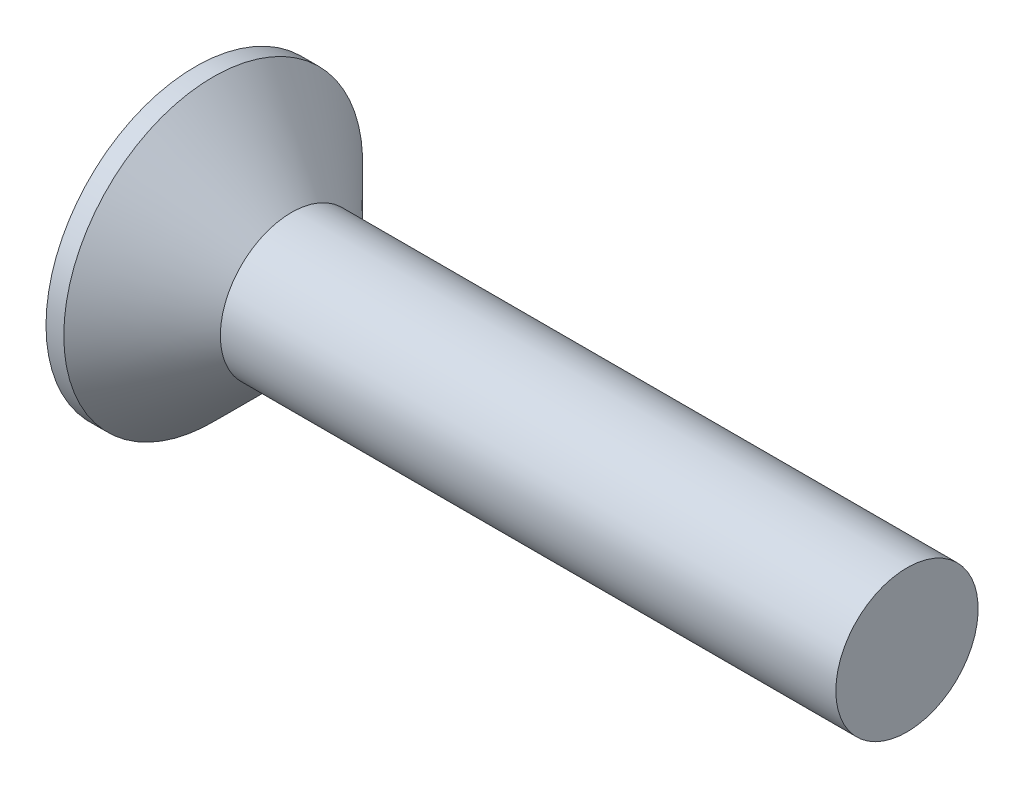
ISO-10303-21;
HEADER;
FILE_DESCRIPTION(('STEP AP214'),'2;1');
FILE_NAME('part.step','',(''),(''),'','','');
FILE_SCHEMA(('AUTOMOTIVE_DESIGN { 1 0 10303 214 1 1 1 1 }'));
ENDSEC;
DATA;
#1=APPLICATION_CONTEXT('core data for automotive mechanical design processes');
#2=APPLICATION_PROTOCOL_DEFINITION('international standard','automotive_design',2000,#1);
#3=PRODUCT_CONTEXT('',#1,'mechanical');
#4=PRODUCT('Part','Part','',(#3));
#5=PRODUCT_RELATED_PRODUCT_CATEGORY('part','',(#4));
#6=PRODUCT_DEFINITION_FORMATION('','',#4);
#7=PRODUCT_DEFINITION_CONTEXT('part definition',#1,'design');
#8=PRODUCT_DEFINITION('design','',#6,#7);
#9=PRODUCT_DEFINITION_SHAPE('','',#8);
#10=(LENGTH_UNIT() NAMED_UNIT(*) SI_UNIT(.MILLI.,.METRE.));
#11=(NAMED_UNIT(*) PLANE_ANGLE_UNIT() SI_UNIT($,.RADIAN.));
#12=(NAMED_UNIT(*) SI_UNIT($,.STERADIAN.) SOLID_ANGLE_UNIT());
#13=UNCERTAINTY_MEASURE_WITH_UNIT(LENGTH_MEASURE(1.E-05),#10,'distance_accuracy_value','');
#14=(GEOMETRIC_REPRESENTATION_CONTEXT(3) GLOBAL_UNCERTAINTY_ASSIGNED_CONTEXT((#13)) GLOBAL_UNIT_ASSIGNED_CONTEXT((#10,
#11,#12)) REPRESENTATION_CONTEXT('',''));
#15=CARTESIAN_POINT('',(0.,0.,0.));
#16=DIRECTION('',(0.,0.,1.));
#17=DIRECTION('',(1.,0.,0.));
#18=AXIS2_PLACEMENT_3D('',#15,#16,#17);
#19=CARTESIAN_POINT('',(2.65,0.24,-0.24));
#20=DIRECTION('',(1.,0.,0.));
#21=DIRECTION('',(0.,0.,-1.));
#22=AXIS2_PLACEMENT_3D('',#19,#20,#21);
#23=PLANE('',#22);
#24=DIRECTION('',(0.,0.,1.));
#25=VECTOR('',#24,1.);
#26=CARTESIAN_POINT('',(2.65,-0.240000000000001,-0.48));
#27=LINE('',#26,#25);
#28=CARTESIAN_POINT('',(2.65,-0.240000000000001,0.24));
#29=VERTEX_POINT('',#28);
#30=CARTESIAN_POINT('',(2.65,-0.24,-0.240000000000001));
#31=VERTEX_POINT('',#30);
#32=EDGE_CURVE('E83',#29,#31,#27,.F.);
#33=ORIENTED_EDGE('',*,*,#32,.F.);
#34=DIRECTION('',(0.,1.,0.));
#35=VECTOR('',#34,1.);
#36=CARTESIAN_POINT('',(2.65,-0.480000000000007,0.239999999999999));
#37=LINE('',#36,#35);
#38=CARTESIAN_POINT('',(2.65,0.24,0.24));
#39=VERTEX_POINT('',#38);
#40=EDGE_CURVE('E122',#39,#29,#37,.F.);
#41=ORIENTED_EDGE('',*,*,#40,.F.);
#42=DIRECTION('',(0.,0.,1.));
#43=VECTOR('',#42,1.);
#44=CARTESIAN_POINT('',(2.65,0.24,0.48));
#45=LINE('',#44,#43);
#46=CARTESIAN_POINT('',(2.65,0.24,-0.24));
#47=VERTEX_POINT('',#46);
#48=EDGE_CURVE('E79',#47,#39,#45,.T.);
#49=ORIENTED_EDGE('',*,*,#48,.F.);
#50=DIRECTION('',(0.,1.,0.));
#51=VECTOR('',#50,1.);
#52=CARTESIAN_POINT('',(2.65,0.480000000000007,-0.239999999999999));
#53=LINE('',#52,#51);
#54=EDGE_CURVE('E81',#31,#47,#53,.T.);
#55=ORIENTED_EDGE('',*,*,#54,.F.);
#56=EDGE_LOOP('',(#33,#41,#49,#55));
#57=FACE_BOUND('',#56,.T.);
#58=ADVANCED_FACE('F17',(#57),#23,.F.);
#59=CARTESIAN_POINT('',(0.,0.480000000000007,-2.23));
#60=DIRECTION('',(-0.600482690889725,0.,0.799637754199885));
#61=DIRECTION('',(0.799637754199885,0.,0.600482690889725));
#62=AXIS2_PLACEMENT_3D('',#59,#60,#61);
#63=PLANE('',#62);
#64=DIRECTION('',(-0.797549052549738,-0.0722308575894082,-0.59891419417886));
#65=VECTOR('',#64,1.);
#66=CARTESIAN_POINT('',(2.65,-0.239999999999999,-0.240000000000001));
#67=LINE('',#66,#65);
#68=CARTESIAN_POINT('',(0.,-0.479999999999994,-2.23));
#69=VERTEX_POINT('',#68);
#70=EDGE_CURVE('E100',#31,#69,#67,.T.);
#71=ORIENTED_EDGE('',*,*,#70,.F.);
#72=ORIENTED_EDGE('',*,*,#54,.T.);
#73=DIRECTION('',(0.797549052549738,-0.0722308575894123,0.59891419417886));
#74=VECTOR('',#73,1.);
#75=CARTESIAN_POINT('',(0.,0.480000000000008,-2.23));
#76=LINE('',#75,#74);
#77=CARTESIAN_POINT('',(0.,0.480000000000008,-2.23));
#78=VERTEX_POINT('',#77);
#79=EDGE_CURVE('E115',#78,#47,#76,.T.);
#80=ORIENTED_EDGE('',*,*,#79,.F.);
#81=DIRECTION('',(0.,1.,0.));
#82=VECTOR('',#81,1.);
#83=CARTESIAN_POINT('',(0.,0.480000000000007,-2.23));
#84=LINE('',#83,#82);
#85=EDGE_CURVE('E90',#78,#69,#84,.F.);
#86=ORIENTED_EDGE('',*,*,#85,.T.);
#87=EDGE_LOOP('',(#71,#72,#80,#86));
#88=FACE_BOUND('',#87,.T.);
#89=ADVANCED_FACE('F101',(#88),#63,.T.);
#90=CARTESIAN_POINT('',(0.,2.23,0.48));
#91=DIRECTION('',(-0.600482690889725,-0.799637754199885,0.));
#92=DIRECTION('',(0.799637754199885,-0.600482690889725,0.));
#93=AXIS2_PLACEMENT_3D('',#90,#91,#92);
#94=PLANE('',#93);
#95=DIRECTION('',(-0.797549052549738,0.59891419417886,-0.0722308575894102));
#96=VECTOR('',#95,1.);
#97=CARTESIAN_POINT('',(2.65,0.24,-0.24));
#98=LINE('',#97,#96);
#99=CARTESIAN_POINT('',(0.,2.23,-0.48));
#100=VERTEX_POINT('',#99);
#101=EDGE_CURVE('E156',#47,#100,#98,.T.);
#102=ORIENTED_EDGE('',*,*,#101,.F.);
#103=ORIENTED_EDGE('',*,*,#48,.T.);
#104=DIRECTION('',(0.797549052549738,-0.59891419417886,-0.0722308575894101));
#105=VECTOR('',#104,1.);
#106=CARTESIAN_POINT('',(0.,2.23,0.48));
#107=LINE('',#106,#105);
#108=CARTESIAN_POINT('',(0.,2.23,0.48));
#109=VERTEX_POINT('',#108);
#110=EDGE_CURVE('E153',#109,#39,#107,.T.);
#111=ORIENTED_EDGE('',*,*,#110,.F.);
#112=DIRECTION('',(0.,0.,1.));
#113=VECTOR('',#112,1.);
#114=CARTESIAN_POINT('',(0.,2.23,0.48));
#115=LINE('',#114,#113);
#116=EDGE_CURVE('E89',#109,#100,#115,.F.);
#117=ORIENTED_EDGE('',*,*,#116,.T.);
#118=EDGE_LOOP('',(#102,#103,#111,#117));
#119=FACE_BOUND('',#118,.T.);
#120=ADVANCED_FACE('F171',(#119),#94,.T.);
#121=CARTESIAN_POINT('',(0.,-0.480000000000007,2.23));
#122=DIRECTION('',(-0.600482690889725,0.,-0.799637754199885));
#123=DIRECTION('',(-0.799637754199885,0.,0.600482690889725));
#124=AXIS2_PLACEMENT_3D('',#121,#122,#123);
#125=PLANE('',#124);
#126=DIRECTION('',(-0.797549052549738,0.0722308575894081,0.59891419417886));
#127=VECTOR('',#126,1.);
#128=CARTESIAN_POINT('',(2.65,0.239999999999999,0.24));
#129=LINE('',#128,#127);
#130=CARTESIAN_POINT('',(0.,0.479999999999993,2.23));
#131=VERTEX_POINT('',#130);
#132=EDGE_CURVE('E150',#39,#131,#129,.T.);
#133=ORIENTED_EDGE('',*,*,#132,.F.);
#134=ORIENTED_EDGE('',*,*,#40,.T.);
#135=DIRECTION('',(0.797549052549738,0.0722308575894122,-0.59891419417886));
#136=VECTOR('',#135,1.);
#137=CARTESIAN_POINT('',(0.,-0.480000000000007,2.23));
#138=LINE('',#137,#136);
#139=CARTESIAN_POINT('',(0.,-0.480000000000007,2.23));
#140=VERTEX_POINT('',#139);
#141=EDGE_CURVE('E144',#140,#29,#138,.T.);
#142=ORIENTED_EDGE('',*,*,#141,.F.);
#143=DIRECTION('',(0.,1.,0.));
#144=VECTOR('',#143,1.);
#145=CARTESIAN_POINT('',(0.,-0.480000000000007,2.23));
#146=LINE('',#145,#144);
#147=EDGE_CURVE('E124',#140,#131,#146,.T.);
#148=ORIENTED_EDGE('',*,*,#147,.T.);
#149=EDGE_LOOP('',(#133,#134,#142,#148));
#150=FACE_BOUND('',#149,.T.);
#151=ADVANCED_FACE('F199',(#150),#125,.T.);
#152=CARTESIAN_POINT('',(0.,-2.23,-0.48));
#153=DIRECTION('',(-0.600482690889725,0.799637754199885,0.));
#154=DIRECTION('',(-0.799637754199885,-0.600482690889725,0.));
#155=AXIS2_PLACEMENT_3D('',#152,#153,#154);
#156=PLANE('',#155);
#157=DIRECTION('',(-0.797549052549738,-0.59891419417886,0.0722308575894103));
#158=VECTOR('',#157,1.);
#159=CARTESIAN_POINT('',(2.65,-0.240000000000001,0.24));
#160=LINE('',#159,#158);
#161=CARTESIAN_POINT('',(0.,-2.23,0.48));
#162=VERTEX_POINT('',#161);
#163=EDGE_CURVE('E96',#29,#162,#160,.T.);
#164=ORIENTED_EDGE('',*,*,#163,.F.);
#165=ORIENTED_EDGE('',*,*,#32,.T.);
#166=DIRECTION('',(0.797549052549738,0.59891419417886,0.0722308575894102));
#167=VECTOR('',#166,1.);
#168=CARTESIAN_POINT('',(0.,-2.23,-0.48));
#169=LINE('',#168,#167);
#170=CARTESIAN_POINT('',(0.,-2.23,-0.48));
#171=VERTEX_POINT('',#170);
#172=EDGE_CURVE('E94',#171,#31,#169,.T.);
#173=ORIENTED_EDGE('',*,*,#172,.F.);
#174=DIRECTION('',(0.,0.,1.));
#175=VECTOR('',#174,1.);
#176=CARTESIAN_POINT('',(0.,-2.23,-0.48));
#177=LINE('',#176,#175);
#178=EDGE_CURVE('E35',#171,#162,#177,.T.);
#179=ORIENTED_EDGE('',*,*,#178,.T.);
#180=EDGE_LOOP('',(#164,#165,#173,#179));
#181=FACE_BOUND('',#180,.T.);
#182=ADVANCED_FACE('F92',(#181),#156,.T.);
#183=CARTESIAN_POINT('',(2.96959798994975,0.,-0.21105527638191));
#184=DIRECTION('',(-0.0901968863789277,0.,0.995923953767328));
#185=DIRECTION('',(0.995923953767328,0.,0.0901968863789277));
#186=AXIS2_PLACEMENT_3D('',#183,#184,#185);
#187=PLANE('',#186);
#188=DIRECTION('',(0.991897347093265,0.0898322125669369,0.0898322125669369));
#189=VECTOR('',#188,1.);
#190=CARTESIAN_POINT('',(0.,-0.479999999999998,-0.48));
#191=LINE('',#190,#189);
#192=CARTESIAN_POINT('',(0.,-0.479999999999998,-0.48));
#193=VERTEX_POINT('',#192);
#194=EDGE_CURVE('E106',#193,#31,#191,.T.);
#195=ORIENTED_EDGE('',*,*,#194,.F.);
#196=DIRECTION('',(0.,1.,0.));
#197=VECTOR('',#196,1.);
#198=CARTESIAN_POINT('',(0.,0.,-0.48));
#199=LINE('',#198,#197);
#200=EDGE_CURVE('E111',#171,#193,#199,.T.);
#201=ORIENTED_EDGE('',*,*,#200,.F.);
#202=ORIENTED_EDGE('',*,*,#172,.T.);
#203=EDGE_LOOP('',(#195,#201,#202));
#204=FACE_BOUND('',#203,.T.);
#205=ADVANCED_FACE('F109',(#204),#187,.T.);
#206=CARTESIAN_POINT('',(2.96959798994975,-0.21105527638191,0.));
#207=DIRECTION('',(-0.0901968863789278,0.995923953767328,0.));
#208=DIRECTION('',(-0.995923953767328,-0.0901968863789278,0.));
#209=AXIS2_PLACEMENT_3D('',#206,#207,#208);
#210=PLANE('',#209);
#211=DIRECTION('',(0.,0.,1.));
#212=VECTOR('',#211,1.);
#213=CARTESIAN_POINT('',(0.,-0.479999999999998,0.));
#214=LINE('',#213,#212);
#215=EDGE_CURVE('E114',#193,#69,#214,.F.);
#216=ORIENTED_EDGE('',*,*,#215,.F.);
#217=ORIENTED_EDGE('',*,*,#194,.T.);
#218=ORIENTED_EDGE('',*,*,#70,.T.);
#219=EDGE_LOOP('',(#216,#217,#218));
#220=FACE_BOUND('',#219,.T.);
#221=ADVANCED_FACE('F113',(#220),#210,.T.);
#222=CARTESIAN_POINT('',(2.96959798994975,0.21105527638191,0.));
#223=DIRECTION('',(-0.0901968863789277,-0.995923953767328,0.));
#224=DIRECTION('',(0.995923953767328,-0.0901968863789277,0.));
#225=AXIS2_PLACEMENT_3D('',#222,#223,#224);
#226=PLANE('',#225);
#227=ORIENTED_EDGE('',*,*,#79,.T.);
#228=DIRECTION('',(0.991897347093265,-0.0898322125669377,0.0898322125669371));
#229=VECTOR('',#228,1.);
#230=CARTESIAN_POINT('',(0.,0.480000000000001,-0.48));
#231=LINE('',#230,#229);
#232=CARTESIAN_POINT('',(0.,0.480000000000003,-0.48));
#233=VERTEX_POINT('',#232);
#234=EDGE_CURVE('E117',#233,#47,#231,.T.);
#235=ORIENTED_EDGE('',*,*,#234,.F.);
#236=DIRECTION('',(0.,0.,1.));
#237=VECTOR('',#236,1.);
#238=CARTESIAN_POINT('',(0.,0.480000000000008,0.));
#239=LINE('',#238,#237);
#240=EDGE_CURVE('E169',#78,#233,#239,.T.);
#241=ORIENTED_EDGE('',*,*,#240,.F.);
#242=EDGE_LOOP('',(#227,#235,#241));
#243=FACE_BOUND('',#242,.T.);
#244=ADVANCED_FACE('F168',(#243),#226,.T.);
#245=CARTESIAN_POINT('',(2.96959798994975,0.,-0.21105527638191));
#246=DIRECTION('',(-0.0901968863789277,0.,0.995923953767328));
#247=DIRECTION('',(0.995923953767328,0.,0.0901968863789277));
#248=AXIS2_PLACEMENT_3D('',#245,#246,#247);
#249=PLANE('',#248);
#250=ORIENTED_EDGE('',*,*,#234,.T.);
#251=ORIENTED_EDGE('',*,*,#101,.T.);
#252=DIRECTION('',(0.,1.,0.));
#253=VECTOR('',#252,1.);
#254=CARTESIAN_POINT('',(0.,0.,-0.48));
#255=LINE('',#254,#253);
#256=EDGE_CURVE('E164',#233,#100,#255,.T.);
#257=ORIENTED_EDGE('',*,*,#256,.F.);
#258=EDGE_LOOP('',(#250,#251,#257));
#259=FACE_BOUND('',#258,.T.);
#260=ADVANCED_FACE('F161',(#259),#249,.T.);
#261=CARTESIAN_POINT('',(2.96959798994975,0.,0.21105527638191));
#262=DIRECTION('',(-0.0901968863789278,0.,-0.995923953767328));
#263=DIRECTION('',(-0.995923953767328,0.,0.0901968863789278));
#264=AXIS2_PLACEMENT_3D('',#261,#262,#263);
#265=PLANE('',#264);
#266=DIRECTION('',(0.991897347093265,-0.0898322125669368,-0.0898322125669372));
#267=VECTOR('',#266,1.);
#268=CARTESIAN_POINT('',(0.,0.479999999999998,0.48));
#269=LINE('',#268,#267);
#270=CARTESIAN_POINT('',(0.,0.479999999999998,0.48));
#271=VERTEX_POINT('',#270);
#272=EDGE_CURVE('E147',#271,#39,#269,.T.);
#273=ORIENTED_EDGE('',*,*,#272,.F.);
#274=DIRECTION('',(0.,1.,0.));
#275=VECTOR('',#274,1.);
#276=CARTESIAN_POINT('',(0.,0.,0.48));
#277=LINE('',#276,#275);
#278=EDGE_CURVE('E181',#109,#271,#277,.F.);
#279=ORIENTED_EDGE('',*,*,#278,.F.);
#280=ORIENTED_EDGE('',*,*,#110,.T.);
#281=EDGE_LOOP('',(#273,#279,#280));
#282=FACE_BOUND('',#281,.T.);
#283=ADVANCED_FACE('F201',(#282),#265,.T.);
#284=CARTESIAN_POINT('',(2.96959798994975,0.21105527638191,0.));
#285=DIRECTION('',(-0.0901968863789277,-0.995923953767328,0.));
#286=DIRECTION('',(0.995923953767328,-0.0901968863789277,0.));
#287=AXIS2_PLACEMENT_3D('',#284,#285,#286);
#288=PLANE('',#287);
#289=DIRECTION('',(0.,0.,1.));
#290=VECTOR('',#289,1.);
#291=CARTESIAN_POINT('',(0.,0.479999999999998,0.));
#292=LINE('',#291,#290);
#293=EDGE_CURVE('E183',#271,#131,#292,.T.);
#294=ORIENTED_EDGE('',*,*,#293,.F.);
#295=ORIENTED_EDGE('',*,*,#272,.T.);
#296=ORIENTED_EDGE('',*,*,#132,.T.);
#297=EDGE_LOOP('',(#294,#295,#296));
#298=FACE_BOUND('',#297,.T.);
#299=ADVANCED_FACE('F197',(#298),#288,.T.);
#300=CARTESIAN_POINT('',(2.96959798994975,-0.21105527638191,0.));
#301=DIRECTION('',(-0.0901968863789278,0.995923953767328,0.));
#302=DIRECTION('',(-0.995923953767328,-0.0901968863789278,0.));
#303=AXIS2_PLACEMENT_3D('',#300,#301,#302);
#304=PLANE('',#303);
#305=ORIENTED_EDGE('',*,*,#141,.T.);
#306=DIRECTION('',(0.991897347093265,0.0898322125669375,-0.0898322125669372));
#307=VECTOR('',#306,1.);
#308=CARTESIAN_POINT('',(0.,-0.480000000000002,0.48));
#309=LINE('',#308,#307);
#310=CARTESIAN_POINT('',(0.,-0.480000000000003,0.48));
#311=VERTEX_POINT('',#310);
#312=EDGE_CURVE('E142',#311,#29,#309,.T.);
#313=ORIENTED_EDGE('',*,*,#312,.F.);
#314=DIRECTION('',(0.,0.,1.));
#315=VECTOR('',#314,1.);
#316=CARTESIAN_POINT('',(0.,-0.480000000000007,0.));
#317=LINE('',#316,#315);
#318=EDGE_CURVE('E190',#140,#311,#317,.F.);
#319=ORIENTED_EDGE('',*,*,#318,.F.);
#320=EDGE_LOOP('',(#305,#313,#319));
#321=FACE_BOUND('',#320,.T.);
#322=ADVANCED_FACE('F209',(#321),#304,.T.);
#323=CARTESIAN_POINT('',(2.96959798994975,0.,0.21105527638191));
#324=DIRECTION('',(-0.0901968863789278,0.,-0.995923953767328));
#325=DIRECTION('',(-0.995923953767328,0.,0.0901968863789278));
#326=AXIS2_PLACEMENT_3D('',#323,#324,#325);
#327=PLANE('',#326);
#328=ORIENTED_EDGE('',*,*,#312,.T.);
#329=ORIENTED_EDGE('',*,*,#163,.T.);
#330=DIRECTION('',(0.,1.,0.));
#331=VECTOR('',#330,1.);
#332=CARTESIAN_POINT('',(0.,0.,0.48));
#333=LINE('',#332,#331);
#334=EDGE_CURVE('E137',#311,#162,#333,.F.);
#335=ORIENTED_EDGE('',*,*,#334,.F.);
#336=EDGE_LOOP('',(#328,#329,#335));
#337=FACE_BOUND('',#336,.T.);
#338=ADVANCED_FACE('F232',(#337),#327,.T.);
#339=CARTESIAN_POINT('',(0.,0.,0.));
#340=DIRECTION('',(-1.,0.,0.));
#341=DIRECTION('',(0.,0.,1.));
#342=AXIS2_PLACEMENT_3D('',#339,#340,#341);
#343=PLANE('',#342);
#344=ORIENTED_EDGE('',*,*,#334,.T.);
#345=ORIENTED_EDGE('',*,*,#178,.F.);
#346=ORIENTED_EDGE('',*,*,#200,.T.);
#347=ORIENTED_EDGE('',*,*,#215,.T.);
#348=ORIENTED_EDGE('',*,*,#85,.F.);
#349=ORIENTED_EDGE('',*,*,#240,.T.);
#350=ORIENTED_EDGE('',*,*,#256,.T.);
#351=ORIENTED_EDGE('',*,*,#116,.F.);
#352=ORIENTED_EDGE('',*,*,#278,.T.);
#353=ORIENTED_EDGE('',*,*,#293,.T.);
#354=ORIENTED_EDGE('',*,*,#147,.F.);
#355=ORIENTED_EDGE('',*,*,#318,.T.);
#356=EDGE_LOOP('',(#344,#345,#346,#347,#348,#349,#350,#351,#352,#353,#354,#355));
#357=FACE_BOUND('',#356,.T.);
#358=CARTESIAN_POINT('',(0.,0.,0.));
#359=DIRECTION('',(-1.,0.,0.));
#360=DIRECTION('',(0.,0.,1.));
#361=AXIS2_PLACEMENT_3D('',#358,#359,#360);
#362=CIRCLE('',#361,4.2);
#363=CARTESIAN_POINT('',(0.,0.,4.2));
#364=VERTEX_POINT('',#363);
#365=EDGE_CURVE('E20',#364,#364,#362,.F.);
#366=ORIENTED_EDGE('',*,*,#365,.F.);
#367=EDGE_LOOP('',(#366));
#368=FACE_BOUND('',#367,.T.);
#369=ADVANCED_FACE('F178',(#357,#368),#343,.T.);
#370=CARTESIAN_POINT('',(-6.34999999999999,0.,0.));
#371=DIRECTION('',(-1.,0.,0.));
#372=DIRECTION('',(0.,0.,1.));
#373=AXIS2_PLACEMENT_3D('',#370,#371,#372);
#374=CYLINDRICAL_SURFACE('',#373,4.2);
#375=ORIENTED_EDGE('',*,*,#365,.T.);
#376=EDGE_LOOP('',(#375));
#377=FACE_BOUND('',#376,.T.);
#378=CARTESIAN_POINT('',(0.499999999988177,0.,0.));
#379=DIRECTION('',(-1.,0.,0.));
#380=DIRECTION('',(0.,0.,1.));
#381=AXIS2_PLACEMENT_3D('',#378,#379,#380);
#382=CIRCLE('',#381,4.20000000002574);
#383=CARTESIAN_POINT('',(0.499999999988177,0.,4.20000000002574));
#384=VERTEX_POINT('',#383);
#385=EDGE_CURVE('E129',#384,#384,#382,.F.);
#386=ORIENTED_EDGE('',*,*,#385,.F.);
#387=EDGE_LOOP('',(#386));
#388=FACE_BOUND('',#387,.T.);
#389=ADVANCED_FACE('F225',(#377,#388),#374,.T.);
#390=CARTESIAN_POINT('',(20.,2.,0.));
#391=DIRECTION('',(1.,0.,0.));
#392=DIRECTION('',(0.,0.,-1.));
#393=AXIS2_PLACEMENT_3D('',#390,#391,#392);
#394=PLANE('',#393);
#395=CARTESIAN_POINT('',(20.,0.,0.));
#396=DIRECTION('',(-1.,0.,0.));
#397=DIRECTION('',(0.,0.,1.));
#398=AXIS2_PLACEMENT_3D('',#395,#396,#397);
#399=CIRCLE('',#398,2.);
#400=CARTESIAN_POINT('',(20.,0.,2.));
#401=VERTEX_POINT('',#400);
#402=EDGE_CURVE('E26',#401,#401,#399,.T.);
#403=ORIENTED_EDGE('',*,*,#402,.F.);
#404=EDGE_LOOP('',(#403));
#405=FACE_BOUND('',#404,.T.);
#406=ADVANCED_FACE('F220',(#405),#394,.T.);
#407=CARTESIAN_POINT('',(0.500000000101863,0.,0.));
#408=DIRECTION('',(-1.,0.,0.));
#409=DIRECTION('',(0.,0.,1.));
#410=AXIS2_PLACEMENT_3D('',#407,#408,#409);
#411=CONICAL_SURFACE('',#410,4.1999999999689,0.785398163410367);
#412=ORIENTED_EDGE('',*,*,#385,.T.);
#413=EDGE_LOOP('',(#412));
#414=FACE_BOUND('',#413,.T.);
#415=CARTESIAN_POINT('',(2.7,0.,0.));
#416=DIRECTION('',(-1.,0.,0.));
#417=DIRECTION('',(0.,0.,1.));
#418=AXIS2_PLACEMENT_3D('',#415,#416,#417);
#419=CIRCLE('',#418,2.);
#420=CARTESIAN_POINT('',(2.7,0.,2.));
#421=VERTEX_POINT('',#420);
#422=EDGE_CURVE('E11',#421,#421,#419,.F.);
#423=ORIENTED_EDGE('',*,*,#422,.F.);
#424=EDGE_LOOP('',(#423));
#425=FACE_BOUND('',#424,.T.);
#426=ADVANCED_FACE('F214',(#414,#425),#411,.T.);
#427=CARTESIAN_POINT('',(-6.34999999999999,0.,0.));
#428=DIRECTION('',(-1.,0.,0.));
#429=DIRECTION('',(0.,0.,1.));
#430=AXIS2_PLACEMENT_3D('',#427,#428,#429);
#431=CYLINDRICAL_SURFACE('',#430,2.);
#432=ORIENTED_EDGE('',*,*,#422,.T.);
#433=EDGE_LOOP('',(#432));
#434=FACE_BOUND('',#433,.T.);
#435=ORIENTED_EDGE('',*,*,#402,.T.);
#436=EDGE_LOOP('',(#435));
#437=FACE_BOUND('',#436,.T.);
#438=ADVANCED_FACE('F212',(#434,#437),#431,.T.);
#439=CLOSED_SHELL('',(#58,#89,#120,#151,#182,#205,#221,#244,#260,#283,#299,#322,#338,#369,#389,
#406,#426,#438));
#440=MANIFOLD_SOLID_BREP('B1',#439);
#441=ADVANCED_BREP_SHAPE_REPRESENTATION('',(#18,#440),#14);
#442=SHAPE_DEFINITION_REPRESENTATION(#9,#441);
ENDSEC;
END-ISO-10303-21;
